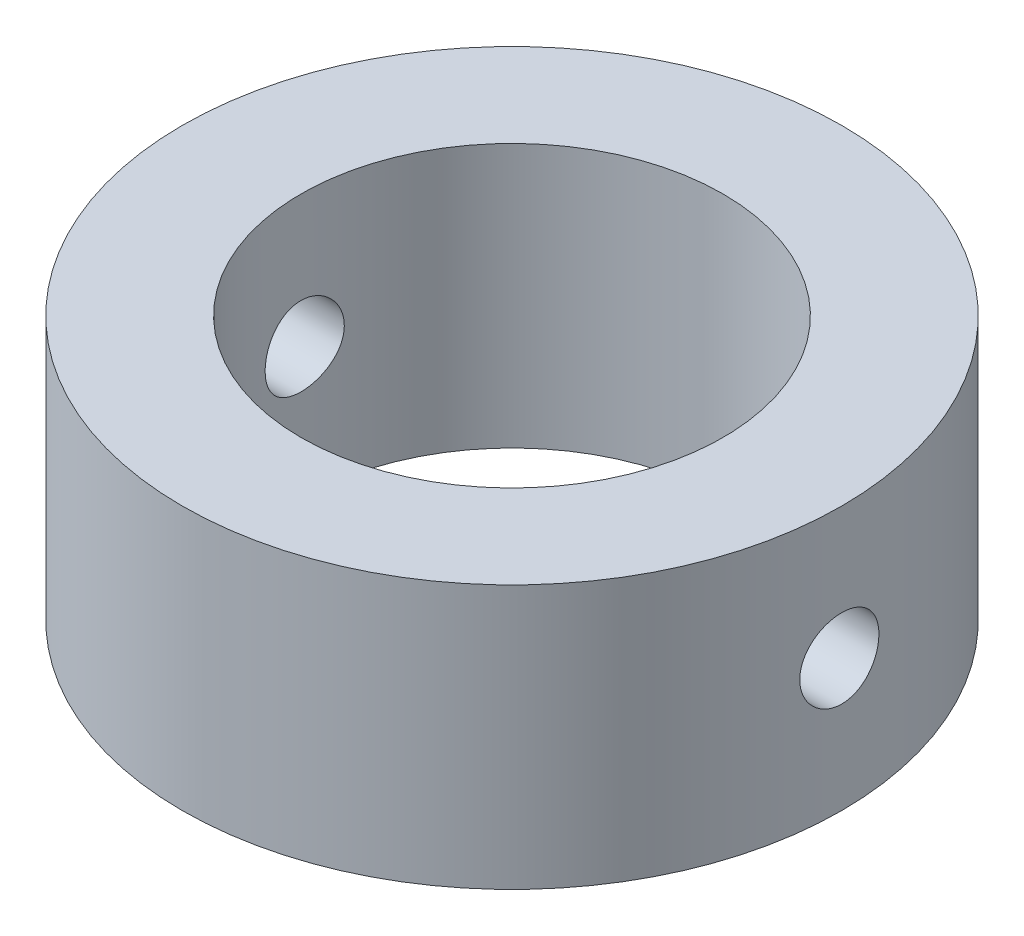
ISO-10303-21;
HEADER;
FILE_DESCRIPTION(('STEP AP214'),'2;1');
FILE_NAME('part.step','',(''),(''),'','','');
FILE_SCHEMA(('AUTOMOTIVE_DESIGN { 1 0 10303 214 1 1 1 1 }'));
ENDSEC;
DATA;
#1=APPLICATION_CONTEXT('core data for automotive mechanical design processes');
#2=APPLICATION_PROTOCOL_DEFINITION('international standard','automotive_design',2000,#1);
#3=PRODUCT_CONTEXT('',#1,'mechanical');
#4=PRODUCT('Part','Part','',(#3));
#5=PRODUCT_RELATED_PRODUCT_CATEGORY('part','',(#4));
#6=PRODUCT_DEFINITION_FORMATION('','',#4);
#7=PRODUCT_DEFINITION_CONTEXT('part definition',#1,'design');
#8=PRODUCT_DEFINITION('design','',#6,#7);
#9=PRODUCT_DEFINITION_SHAPE('','',#8);
#10=(LENGTH_UNIT() NAMED_UNIT(*) SI_UNIT(.MILLI.,.METRE.));
#11=(NAMED_UNIT(*) PLANE_ANGLE_UNIT() SI_UNIT($,.RADIAN.));
#12=(NAMED_UNIT(*) SI_UNIT($,.STERADIAN.) SOLID_ANGLE_UNIT());
#13=UNCERTAINTY_MEASURE_WITH_UNIT(LENGTH_MEASURE(1.E-05),#10,'distance_accuracy_value','');
#14=(GEOMETRIC_REPRESENTATION_CONTEXT(3) GLOBAL_UNCERTAINTY_ASSIGNED_CONTEXT((#13)) GLOBAL_UNIT_ASSIGNED_CONTEXT((#10,
#11,#12)) REPRESENTATION_CONTEXT('',''));
#15=CARTESIAN_POINT('',(0.,0.,0.));
#16=DIRECTION('',(0.,0.,1.));
#17=DIRECTION('',(1.,0.,0.));
#18=AXIS2_PLACEMENT_3D('',#15,#16,#17);
#19=CARTESIAN_POINT('',(0.,10.,0.));
#20=DIRECTION('',(0.,1.,0.));
#21=DIRECTION('',(0.,0.,1.));
#22=AXIS2_PLACEMENT_3D('',#19,#20,#21);
#23=PLANE('',#22);
#24=CARTESIAN_POINT('',(0.,10.,0.));
#25=DIRECTION('',(0.,1.,0.));
#26=DIRECTION('',(0.,0.,1.));
#27=AXIS2_PLACEMENT_3D('',#24,#25,#26);
#28=CIRCLE('',#27,12.5);
#29=CARTESIAN_POINT('',(0.,10.,12.5));
#30=VERTEX_POINT('',#29);
#31=EDGE_CURVE('E10',#30,#30,#28,.T.);
#32=ORIENTED_EDGE('',*,*,#31,.T.);
#33=EDGE_LOOP('',(#32));
#34=FACE_BOUND('',#33,.T.);
#35=CARTESIAN_POINT('',(0.,10.,0.));
#36=DIRECTION('',(0.,1.,0.));
#37=DIRECTION('',(0.,0.,1.));
#38=AXIS2_PLACEMENT_3D('',#35,#36,#37);
#39=CIRCLE('',#38,8.);
#40=CARTESIAN_POINT('',(0.,10.,8.));
#41=VERTEX_POINT('',#40);
#42=EDGE_CURVE('E48',#41,#41,#39,.T.);
#43=ORIENTED_EDGE('',*,*,#42,.F.);
#44=EDGE_LOOP('',(#43));
#45=FACE_BOUND('',#44,.T.);
#46=ADVANCED_FACE('F30',(#34,#45),#23,.T.);
#47=CARTESIAN_POINT('',(0.,0.,0.));
#48=DIRECTION('',(0.,1.,0.));
#49=DIRECTION('',(0.,0.,1.));
#50=AXIS2_PLACEMENT_3D('',#47,#48,#49);
#51=PLANE('',#50);
#52=CARTESIAN_POINT('',(0.,0.,0.));
#53=DIRECTION('',(0.,1.,0.));
#54=DIRECTION('',(0.,0.,1.));
#55=AXIS2_PLACEMENT_3D('',#52,#53,#54);
#56=CIRCLE('',#55,12.5);
#57=CARTESIAN_POINT('',(0.,0.,12.5));
#58=VERTEX_POINT('',#57);
#59=EDGE_CURVE('E43',#58,#58,#56,.T.);
#60=ORIENTED_EDGE('',*,*,#59,.F.);
#61=EDGE_LOOP('',(#60));
#62=FACE_BOUND('',#61,.T.);
#63=CARTESIAN_POINT('',(0.,0.,0.));
#64=DIRECTION('',(0.,1.,0.));
#65=DIRECTION('',(0.,0.,1.));
#66=AXIS2_PLACEMENT_3D('',#63,#64,#65);
#67=CIRCLE('',#66,8.);
#68=CARTESIAN_POINT('',(0.,0.,8.));
#69=VERTEX_POINT('',#68);
#70=EDGE_CURVE('E51',#69,#69,#67,.T.);
#71=ORIENTED_EDGE('',*,*,#70,.T.);
#72=EDGE_LOOP('',(#71));
#73=FACE_BOUND('',#72,.T.);
#74=ADVANCED_FACE('F84',(#62,#73),#51,.F.);
#75=CARTESIAN_POINT('',(0.,10.,0.));
#76=DIRECTION('',(0.,-1.,0.));
#77=DIRECTION('',(0.,0.,-1.));
#78=AXIS2_PLACEMENT_3D('',#75,#76,#77);
#79=CYLINDRICAL_SURFACE('',#78,12.5);
#80=CARTESIAN_POINT('',(12.5,3.5,0.));
#81=CARTESIAN_POINT('',(12.499998867873,3.50000358197072,0.0839320235538497));
#82=CARTESIAN_POINT('',(12.4991457100204,3.50706832934634,0.167917158665596));
#83=CARTESIAN_POINT('',(12.495824352711,3.53514053207769,0.333552285654125));
#84=CARTESIAN_POINT('',(12.4933544466864,3.55616272062529,0.415199714795034));
#85=CARTESIAN_POINT('',(12.4870779632713,3.61152313826301,0.573737397670264));
#86=CARTESIAN_POINT('',(12.4832722657654,3.64585260341209,0.650630743796124));
#87=CARTESIAN_POINT('',(12.4747479632173,3.72683436754165,0.797549578916));
#88=CARTESIAN_POINT('',(12.470029520207,3.77348447987666,0.867576283567579));
#89=CARTESIAN_POINT('',(12.460180052721,3.87803743098762,0.999145657672256));
#90=CARTESIAN_POINT('',(12.4550472515452,3.93599042005596,1.0606483456536));
#91=CARTESIAN_POINT('',(12.4449619698576,4.06139648244395,1.17307965519171));
#92=CARTESIAN_POINT('',(12.4400094983534,4.12885002950932,1.22400774913237));
#93=CARTESIAN_POINT('',(12.4308280185202,4.27160041264919,1.31399171436948));
#94=CARTESIAN_POINT('',(12.4266012951985,4.34692086229007,1.35301037836285));
#95=CARTESIAN_POINT('',(12.4193730672343,4.50310435105437,1.4178302865078));
#96=CARTESIAN_POINT('',(12.4163715196899,4.58396719598465,1.44363199348388));
#97=CARTESIAN_POINT('',(12.4119503036869,4.74852642965571,1.481164650227));
#98=CARTESIAN_POINT('',(12.4105230726271,4.83220726421384,1.49296288993823));
#99=CARTESIAN_POINT('',(12.4093888845306,5.00037246818208,1.50236187609835));
#100=CARTESIAN_POINT('',(12.4096818635516,5.08485680760848,1.49996315026424));
#101=CARTESIAN_POINT('',(12.4119480733153,5.25176298239218,1.48109158039334));
#102=CARTESIAN_POINT('',(12.4139124717338,5.33419331934009,1.46469271611151));
#103=CARTESIAN_POINT('',(12.4192864043804,5.49512351391068,1.41840173085033));
#104=CARTESIAN_POINT('',(12.4226959657844,5.5736232975895,1.38850935612907));
#105=CARTESIAN_POINT('',(12.4305861039738,5.72469473411956,1.31599990349931));
#106=CARTESIAN_POINT('',(12.4350693931099,5.79725073917678,1.27335053101962));
#107=CARTESIAN_POINT('',(12.444599699395,5.93420360545788,1.17656086584735));
#108=CARTESIAN_POINT('',(12.4496467403106,5.99860012245129,1.12242008861578));
#109=CARTESIAN_POINT('',(12.4597751654319,6.11783554218219,1.0037737778109));
#110=CARTESIAN_POINT('',(12.464856563712,6.17261098492853,0.939204450256079));
#111=CARTESIAN_POINT('',(12.4744510399274,6.27055576050016,0.80175397946936));
#112=CARTESIAN_POINT('',(12.478964116721,6.31372507000958,0.728872819540023));
#113=CARTESIAN_POINT('',(12.4869159430851,6.38723164281983,0.576819654131422));
#114=CARTESIAN_POINT('',(12.4903543736405,6.41756509666522,0.497645789357795));
#115=CARTESIAN_POINT('',(12.4957665326545,6.46448936892545,0.33527801113672));
#116=CARTESIAN_POINT('',(12.4977403242792,6.48108078000224,0.252084271220811));
#117=CARTESIAN_POINT('',(12.4999926250152,6.49996812774884,0.0845871981871081));
#118=CARTESIAN_POINT('',(12.5002815046876,6.50235151620035,0.000293860216025356));
#119=CARTESIAN_POINT('',(12.4991593911616,6.49298571106587,-0.167491034121631));
#120=CARTESIAN_POINT('',(12.4977484312654,6.48123679435232,-0.250982606163664));
#121=CARTESIAN_POINT('',(12.4933916690343,6.44401251799845,-0.414537131964179));
#122=CARTESIAN_POINT('',(12.4904505118954,6.41857869347496,-0.494609673184518));
#123=CARTESIAN_POINT('',(12.4833627750896,6.35474964832321,-0.64935269884323));
#124=CARTESIAN_POINT('',(12.4792161574379,6.31635401925496,-0.724023012961737));
#125=CARTESIAN_POINT('',(12.4701542579347,6.22747854204879,-0.866233588832522));
#126=CARTESIAN_POINT('',(12.4652354042322,6.17694193109459,-0.933738144813755));
#127=CARTESIAN_POINT('',(12.455190895971,6.06529957679592,-1.05933812576102));
#128=CARTESIAN_POINT('',(12.4500652338742,6.00419344792603,-1.11743320736475));
#129=CARTESIAN_POINT('',(12.4401529742471,5.87276219228616,-1.22287397613077));
#130=CARTESIAN_POINT('',(12.4353682915654,5.80239049232808,-1.27016181615969));
#131=CARTESIAN_POINT('',(12.4267107496692,5.65465248746222,-1.35224657214666));
#132=CARTESIAN_POINT('',(12.4228378733971,5.57728631344088,-1.38704372178037));
#133=CARTESIAN_POINT('',(12.4164552867251,5.41794469555265,-1.44306498334079));
#134=CARTESIAN_POINT('',(12.4139422637816,5.33598099407031,-1.46432210079673));
#135=CARTESIAN_POINT('',(12.4105542637293,5.16961551525747,-1.49276636081758));
#136=CARTESIAN_POINT('',(12.4096792168553,5.08521384192134,-1.49995410263041));
#137=CARTESIAN_POINT('',(12.4096681633035,4.91694363518141,-1.50004516908965));
#138=CARTESIAN_POINT('',(12.4105210931972,4.83307513711437,-1.49303936835675));
#139=CARTESIAN_POINT('',(12.4138461473713,4.66771660680292,-1.46513424336044));
#140=CARTESIAN_POINT('',(12.4163182722328,4.58622657541221,-1.44423491411034));
#141=CARTESIAN_POINT('',(12.4225998262293,4.42794773055565,-1.38916369910273));
#142=CARTESIAN_POINT('',(12.4264088508406,4.35115750325226,-1.35499582785269));
#143=CARTESIAN_POINT('',(12.4349357269569,4.20438612646495,-1.27436641314005));
#144=CARTESIAN_POINT('',(12.4396535863076,4.13440503577035,-1.22790476354723));
#145=CARTESIAN_POINT('',(12.4495027561294,4.00277352994558,-1.12366844823603));
#146=CARTESIAN_POINT('',(12.4546364290673,3.94117694836686,-1.06582601965075));
#147=CARTESIAN_POINT('',(12.4647177484085,3.828528760217,-0.940610466672237));
#148=CARTESIAN_POINT('',(12.4696653505255,3.7774796511854,-0.873235091318004));
#149=CARTESIAN_POINT('',(12.4788360854662,3.68722471100057,-0.730596612325683));
#150=CARTESIAN_POINT('',(12.4830566108105,3.64806113713886,-0.655306617312087));
#151=CARTESIAN_POINT('',(12.4902709259863,3.58298811777871,-0.499211375842655));
#152=CARTESIAN_POINT('',(12.4932660590307,3.55706415190981,-0.418412282181072));
#153=CARTESIAN_POINT('',(12.4969634163,3.52546828983094,-0.280988550618348));
#154=CARTESIAN_POINT('',(12.4980966397165,3.51593125805681,-0.225233284876743));
#155=CARTESIAN_POINT('',(12.4996153102102,3.50319592825452,-0.112993367846847));
#156=CARTESIAN_POINT('',(12.5000007622246,3.49999758837477,-0.0565087213768126));
#157=CARTESIAN_POINT('',(12.5,3.5,0.));
#158=B_SPLINE_CURVE_WITH_KNOTS('',3,(#80,#81,#82,#83,#84,#85,#86,#87,#88,#89,#90,#91,#92,#93,
#94,#95,#96,#97,#98,#99,#100,#101,#102,#103,#104,#105,#106,#107,#108,#109,#110,#111,#112,#113,
#114,#115,#116,#117,#118,#119,#120,#121,#122,#123,#124,#125,#126,#127,#128,#129,#130,#131,#132,
#133,#134,#135,#136,#137,#138,#139,#140,#141,#142,#143,#144,#145,#146,#147,#148,#149,#150,#151,
#152,#153,#154,#155,#156,#157),.UNSPECIFIED.,.T.,.F.,(4,2,2,2,2,2,2,2,2,2,2,2,2,2,2,2,2,2,2,2,2,
2,2,2,2,2,2,2,2,2,2,2,2,2,2,2,2,2,4),(0.,0.25158967547808,0.503445347043117,0.7551354318778,
1.00678087720846,1.25956936097939,1.51237045452442,1.76595344748199,2.01952755999557,
2.27187819171639,2.5242194433424,2.77523546456127,3.02625620626698,3.27791786855268,
3.52959014434631,3.78286472320159,4.03613981086301,4.28949001347139,4.5428292891131,
4.79460761312113,5.04638100450539,5.29739451278874,5.54841593150834,5.80063460892782,
6.05286248801782,6.30641037908359,6.55995352653149,6.81287624132444,7.06578818330771,
7.31708596596146,7.56838383881169,7.81960573856942,8.07082980715608,8.3235976201016,
8.57642521760045,8.8301414511973,9.08357882396374,9.25296714728134,9.42235435219904),.UNSPECIFIED.);
#159=CARTESIAN_POINT('',(12.5,3.5,0.));
#160=VERTEX_POINT('',#159);
#161=EDGE_CURVE('E74',#160,#160,#158,.T.);
#162=ORIENTED_EDGE('',*,*,#161,.T.);
#163=EDGE_LOOP('',(#162));
#164=FACE_BOUND('',#163,.T.);
#165=CARTESIAN_POINT('',(-12.4096736459909,5.,1.5));
#166=CARTESIAN_POINT('',(-12.4096748089167,4.91607042940482,1.49999641586388));
#167=CARTESIAN_POINT('',(-12.4105342894214,4.8320877399393,1.49293206748169));
#168=CARTESIAN_POINT('',(-12.4138782255216,4.66645769398422,1.46486159354819));
#169=CARTESIAN_POINT('',(-12.4163643992983,4.58481290215949,1.44384072619508));
#170=CARTESIAN_POINT('',(-12.4226761552619,4.42628079724309,1.38848417307918));
#171=CARTESIAN_POINT('',(-12.426500849368,4.34939036943189,1.35415731394874));
#172=CARTESIAN_POINT('',(-12.4350576249844,4.20247642894951,1.27318168778971));
#173=CARTESIAN_POINT('',(-12.4397895458966,4.13245170421602,1.22653510106007));
#174=CARTESIAN_POINT('',(-12.4496550027324,4.00088011419491,1.12198571965019));
#175=CARTESIAN_POINT('',(-12.4547902908254,3.9393738528257,1.06403198625323));
#176=CARTESIAN_POINT('',(-12.4648680792729,3.82693564091905,0.938622932174394));
#177=CARTESIAN_POINT('',(-12.4698105701984,3.7760042070291,0.871167147527068));
#178=CARTESIAN_POINT('',(-12.4789637011531,3.68601673353186,0.728414784233988));
#179=CARTESIAN_POINT('',(-12.4831720690333,3.64699729213018,0.653094976924494));
#180=CARTESIAN_POINT('',(-12.4903635621621,3.58217576980763,0.496912883636388));
#181=CARTESIAN_POINT('',(-12.4933467294733,3.55637323512614,0.41605078804277));
#182=CARTESIAN_POINT('',(-12.4977393662263,3.51883887194827,0.251493928492541));
#183=CARTESIAN_POINT('',(-12.4991563682204,3.50703967327711,0.167814735521689));
#184=CARTESIAN_POINT('',(-12.5002827183051,3.49763820034474,-0.000347248334282786));
#185=CARTESIAN_POINT('',(-12.4999921286017,3.50003540892089,-0.08483000983417));
#186=CARTESIAN_POINT('',(-12.4977421462633,3.51890456092568,-0.251742833758765));
#187=CARTESIAN_POINT('',(-12.4957913442169,3.5353040524862,-0.334181218784107));
#188=CARTESIAN_POINT('',(-12.490449821119,3.581599075858,-0.495127185045589));
#189=CARTESIAN_POINT('',(-12.4870590745233,3.61149484709082,-0.573634696521302));
#190=CARTESIAN_POINT('',(-12.4792038952277,3.68401136445326,-0.724715561629688));
#191=CARTESIAN_POINT('',(-12.4747368094346,3.72666361800321,-0.797273648637692));
#192=CARTESIAN_POINT('',(-12.465229048358,3.82345944947808,-0.934229460099392));
#193=CARTESIAN_POINT('',(-12.4601883488298,3.8776035132078,-0.998626839383445));
#194=CARTESIAN_POINT('',(-12.4500603372648,3.99625217477023,-1.11785860561525));
#195=CARTESIAN_POINT('',(-12.4449729316271,4.06081989068675,-1.17263019439189));
#196=CARTESIAN_POINT('',(-12.4353563023037,4.19826575683975,-1.27056795912578));
#197=CARTESIAN_POINT('',(-12.4308270801297,4.27114392958224,-1.31373410365263));
#198=CARTESIAN_POINT('',(-12.4228396027608,4.42319624507369,-1.38723839179325));
#199=CARTESIAN_POINT('',(-12.4193817467283,4.50237272062895,-1.41757175578821));
#200=CARTESIAN_POINT('',(-12.4139364153306,4.66474617975059,-1.46449505016189));
#201=CARTESIAN_POINT('',(-12.4119488748366,4.74794298505965,-1.48108558929276));
#202=CARTESIAN_POINT('',(-12.4096810007818,4.91544154818834,-1.49996964356083));
#203=CARTESIAN_POINT('',(-12.4093901280317,4.99973321794057,-1.50235142135386));
#204=CARTESIAN_POINT('',(-12.4105206650573,5.16751439042147,-1.49298299027801));
#205=CARTESIAN_POINT('',(-12.411942041265,5.25100390884369,-1.48123305845624));
#206=CARTESIAN_POINT('',(-12.4163273137489,5.41454789179899,-1.44400895971009));
#207=CARTESIAN_POINT('',(-12.4192864301079,5.49461217340466,-1.41857731249469));
#208=CARTESIAN_POINT('',(-12.4264098926624,5.64933964148798,-1.35475538396312));
#209=CARTESIAN_POINT('',(-12.4305742780457,5.72400265225152,-1.31636468129306));
#210=CARTESIAN_POINT('',(-12.4396643656649,5.86620814748731,-1.22749651360805));
#211=CARTESIAN_POINT('',(-12.4445936804928,5.93371414344065,-1.17696103570738));
#212=CARTESIAN_POINT('',(-12.4546467770184,6.0593175565059,-1.06532008918354));
#213=CARTESIAN_POINT('',(-12.4597705656719,6.11741463670294,-1.0042142422181));
#214=CARTESIAN_POINT('',(-12.4696675472455,6.22285987361746,-0.872782136333861));
#215=CARTESIAN_POINT('',(-12.4744387628015,6.27015012325571,-0.802409249708916));
#216=CARTESIAN_POINT('',(-12.483063621558,6.35223910466455,-0.654668214705289));
#217=CARTESIAN_POINT('',(-12.4869172820019,6.38703807118722,-0.577300197822208));
#218=CARTESIAN_POINT('',(-12.4932640215257,6.4430605024379,-0.417959622359992));
#219=CARTESIAN_POINT('',(-12.4957604851314,6.46431775994213,-0.33599908532359));
#220=CARTESIAN_POINT('',(-12.4991255682254,6.49276337179108,-0.169640292495738));
#221=CARTESIAN_POINT('',(-12.4999942550783,6.49995230834657,-0.0852421377306299));
#222=CARTESIAN_POINT('',(-12.5000056524324,6.50004692205616,0.0830300031278301));
#223=CARTESIAN_POINT('',(-12.4991591682624,6.49304201834161,0.166903952329436));
#224=CARTESIAN_POINT('',(-12.4958567701035,6.46513677254876,0.332273612398118));
#225=CARTESIAN_POINT('',(-12.4934008566421,6.44423643502524,0.413769324044744));
#226=CARTESIAN_POINT('',(-12.4871544009745,6.38916099243421,0.572059777991808));
#227=CARTESIAN_POINT('',(-12.4833642539575,6.35498981777275,0.648855904374));
#228=CARTESIAN_POINT('',(-12.474869622158,6.2743519652078,0.795637705262656));
#229=CARTESIAN_POINT('',(-12.4701651299761,6.22788518779857,0.865623324646852));
#230=CARTESIAN_POINT('',(-12.4603319681132,6.12364315899687,0.997254742124292));
#231=CARTESIAN_POINT('',(-12.4552009088046,6.06580132233712,1.0588476339384));
#232=CARTESIAN_POINT('',(-12.4451123432295,5.94058848142378,1.17148865356204));
#233=CARTESIAN_POINT('',(-12.4401548784622,5.87321521774934,1.22253427406543));
#234=CARTESIAN_POINT('',(-12.4309559603764,5.73057853191475,1.31278537364373));
#235=CARTESIAN_POINT('',(-12.4267171228205,5.65528783586352,1.35194799100155));
#236=CARTESIAN_POINT('',(-12.419466118837,5.49919112312461,1.41701902911872));
#237=CARTESIAN_POINT('',(-12.4164526081981,5.41839126440112,1.44294198213015));
#238=CARTESIAN_POINT('',(-12.4127313618494,5.2809702304473,1.4745350503682));
#239=CARTESIAN_POINT('',(-12.4115903654975,5.22521862402006,1.48407082470974));
#240=CARTESIAN_POINT('',(-12.4100611186528,5.11298603393288,1.49680448454756));
#241=CARTESIAN_POINT('',(-12.4096728630583,5.0565050552187,1.50000241299709));
#242=CARTESIAN_POINT('',(-12.4096736459909,5.,1.5));
#243=B_SPLINE_CURVE_WITH_KNOTS('',3,(#165,#166,#167,#168,#169,#170,#171,#172,#173,#174,#175,
#176,#177,#178,#179,#180,#181,#182,#183,#184,#185,#186,#187,#188,#189,#190,#191,#192,#193,#194,
#195,#196,#197,#198,#199,#200,#201,#202,#203,#204,#205,#206,#207,#208,#209,#210,#211,#212,#213,
#214,#215,#216,#217,#218,#219,#220,#221,#222,#223,#224,#225,#226,#227,#228,#229,#230,#231,#232,
#233,#234,#235,#236,#237,#238,#239,#240,#241,#242),.UNSPECIFIED.,.T.,.F.,(4,2,2,2,2,2,2,2,2,2,2,
2,2,2,2,2,2,2,2,2,2,2,2,2,2,2,2,2,2,2,2,2,2,2,2,2,2,2,4),(0.,0.25158230660961,0.503430774819312,
0.755112462522263,1.0067496383611,1.25954776660377,1.51235824273611,1.7659378087677,
2.01950866836447,2.27185458608052,2.52419131111312,2.77523023079344,3.02627360403336,
3.27794222677636,3.52962149067919,3.78288622204422,4.03615163930559,4.28951130338294,
4.54285974404081,4.79463277043148,5.0464008609825,5.29739099483104,5.54838929022027,
5.80061125155309,6.05284224246468,6.30639464647639,6.55994228515919,6.81285470170488,
7.06575665136928,7.31707030939076,7.56838388503438,7.81962308616498,8.07086432058376,
8.32362252061906,8.57644073759112,8.83016031080823,9.08360079205963,9.25297814464872,
9.42235434931909),.UNSPECIFIED.);
#244=CARTESIAN_POINT('',(-12.4096736459909,5.,1.5));
#245=VERTEX_POINT('',#244);
#246=EDGE_CURVE('E70',#245,#245,#243,.T.);
#247=ORIENTED_EDGE('',*,*,#246,.T.);
#248=EDGE_LOOP('',(#247));
#249=FACE_BOUND('',#248,.T.);
#250=ORIENTED_EDGE('',*,*,#31,.F.);
#251=EDGE_LOOP('',(#250));
#252=FACE_BOUND('',#251,.T.);
#253=ORIENTED_EDGE('',*,*,#59,.T.);
#254=EDGE_LOOP('',(#253));
#255=FACE_BOUND('',#254,.T.);
#256=ADVANCED_FACE('F32',(#164,#249,#252,#255),#79,.T.);
#257=CARTESIAN_POINT('',(0.,10.,0.));
#258=DIRECTION('',(0.,-1.,0.));
#259=DIRECTION('',(0.,0.,-1.));
#260=AXIS2_PLACEMENT_3D('',#257,#258,#259);
#261=CYLINDRICAL_SURFACE('',#260,8.);
#262=CARTESIAN_POINT('',(7.85811682275086,5.,1.5));
#263=CARTESIAN_POINT('',(7.85811843793494,5.08345720801174,1.49999679883246));
#264=CARTESIAN_POINT('',(7.85946079760266,5.16695594821839,1.49301126348936));
#265=CARTESIAN_POINT('',(7.86467851014364,5.33159896158191,1.46527253251805));
#266=CARTESIAN_POINT('',(7.86855601173205,5.41274117642748,1.44450765768477));
#267=CARTESIAN_POINT('',(7.87838976464885,5.57026507137088,1.38987035617788));
#268=CARTESIAN_POINT('',(7.88434407905997,5.64665110930729,1.35601013954374));
#269=CARTESIAN_POINT('',(7.89765826320959,5.79265355928681,1.27617565760366));
#270=CARTESIAN_POINT('',(7.90501802325622,5.8622704990033,1.23020233759193));
#271=CARTESIAN_POINT('',(7.92041614838944,5.99363019919913,1.12683678942622));
#272=CARTESIAN_POINT('',(7.92846116625679,6.05527648347173,1.06932292933092));
#273=CARTESIAN_POINT('',(7.94426457664034,6.16810438959956,0.94477177880355));
#274=CARTESIAN_POINT('',(7.95202295031153,6.21928532442479,0.877733863624943));
#275=CARTESIAN_POINT('',(7.96645017828405,6.31009937660052,0.735403894570161));
#276=CARTESIAN_POINT('',(7.97311028052363,6.34964153351942,0.660052840033864));
#277=CARTESIAN_POINT('',(7.98451608632931,6.41546954227353,0.503631283250761));
#278=CARTESIAN_POINT('',(7.98926194728334,6.44175648399022,0.422561251859505));
#279=CARTESIAN_POINT('',(7.99625755123778,6.48002954861113,0.258002746187415));
#280=CARTESIAN_POINT('',(7.99853565976327,6.49217830592269,0.174553323244856));
#281=CARTESIAN_POINT('',(8.00043684615594,6.5023368877004,0.00677167603538234));
#282=CARTESIAN_POINT('',(8.00006015010697,6.50034791613906,-0.077560472447671));
#283=CARTESIAN_POINT('',(7.99671633763241,6.48241222885285,-0.243598357899397));
#284=CARTESIAN_POINT('',(7.99378172247214,6.46664063056999,-0.32532376045147));
#285=CARTESIAN_POINT('',(7.98568826333561,6.42186435060476,-0.484947165715476));
#286=CARTESIAN_POINT('',(7.98052933829966,6.3928591866542,-0.562845028826541));
#287=CARTESIAN_POINT('',(7.96851260297339,6.3222722689417,-0.713110065751522));
#288=CARTESIAN_POINT('',(7.96164537590825,6.2806205120875,-0.785443571838533));
#289=CARTESIAN_POINT('',(7.9469714754285,6.18597433092285,-0.922159977214638));
#290=CARTESIAN_POINT('',(7.93916470651164,6.13297875311242,-0.986542066910785));
#291=CARTESIAN_POINT('',(7.92333513680567,6.01618429701647,-1.10656561896904));
#292=CARTESIAN_POINT('',(7.91531085901621,5.95223221609792,-1.16205790757041));
#293=CARTESIAN_POINT('',(7.9000650892462,5.81585046872137,-1.26155171851261));
#294=CARTESIAN_POINT('',(7.89284360901351,5.74342067823536,-1.30555307271182));
#295=CARTESIAN_POINT('',(7.88001893307121,5.59194172929734,-1.38085852224478));
#296=CARTESIAN_POINT('',(7.87441850530261,5.51288154280936,-1.41214093645421));
#297=CARTESIAN_POINT('',(7.86551242396689,5.3504988158768,-1.46093656975056));
#298=CARTESIAN_POINT('',(7.8622065103862,5.26717675953522,-1.47845134901108));
#299=CARTESIAN_POINT('',(7.85831520301005,5.09998067114412,-1.49899672649739));
#300=CARTESIAN_POINT('',(7.85768955816136,5.01613388443449,-1.50224164285859));
#301=CARTESIAN_POINT('',(7.8591219142084,4.84909654491285,-1.49472968881724));
#302=CARTESIAN_POINT('',(7.86117978238611,4.76590595985192,-1.48397351086433));
#303=CARTESIAN_POINT('',(7.86770980063205,4.60324709694561,-1.44894868195883));
#304=CARTESIAN_POINT('',(7.87216186690878,4.5237537473751,-1.4247923858399));
#305=CARTESIAN_POINT('',(7.88296134156618,4.36994281026984,-1.3637722437906));
#306=CARTESIAN_POINT('',(7.88930888963281,4.29562560468467,-1.32690746128795));
#307=CARTESIAN_POINT('',(7.90327577863685,4.15333238095683,-1.2410235311966));
#308=CARTESIAN_POINT('',(7.91090895425315,4.08543946213393,-1.19186899639621));
#309=CARTESIAN_POINT('',(7.926548113681,3.95878795978567,-1.08298344344247));
#310=CARTESIAN_POINT('',(7.93455413096494,3.90003019844423,-1.02325147433084));
#311=CARTESIAN_POINT('',(7.95016624005946,3.79251623646587,-0.893949417870385));
#312=CARTESIAN_POINT('',(7.95776555833305,3.74390417339403,-0.82425853409589));
#313=CARTESIAN_POINT('',(7.97159404810351,3.65907879382234,-0.67757452304014));
#314=CARTESIAN_POINT('',(7.97782327234725,3.62286499997499,-0.600581677038528));
#315=CARTESIAN_POINT('',(7.98818057995848,3.56407990213592,-0.441877541578684));
#316=CARTESIAN_POINT('',(7.99231954730142,3.54143781243859,-0.360193213078988));
#317=CARTESIAN_POINT('',(7.99807642083745,3.51021295171011,-0.194096227381571));
#318=CARTESIAN_POINT('',(7.99969459229933,3.50162870133729,-0.109683858215851));
#319=CARTESIAN_POINT('',(8.00022227515441,3.49881469848156,0.0580907602505094));
#320=CARTESIAN_POINT('',(7.99917286625032,3.50436724687047,0.141449307066268));
#321=CARTESIAN_POINT('',(7.99456866611703,3.52919242776844,0.3060233692792));
#322=CARTESIAN_POINT('',(7.99101389890671,3.54846492874421,0.38723890521369));
#323=CARTESIAN_POINT('',(7.98179837978045,3.60009120738372,0.545106475595485));
#324=CARTESIAN_POINT('',(7.97614135981576,3.63242181288101,0.621766319318224));
#325=CARTESIAN_POINT('',(7.96333372068771,3.70922045365518,0.768605631316694));
#326=CARTESIAN_POINT('',(7.95618300146483,3.75368930210665,0.838784665003271));
#327=CARTESIAN_POINT('',(7.94104779859941,3.85425145444232,0.971755027780007));
#328=CARTESIAN_POINT('',(7.93305284591272,3.91050203386171,1.03442623539053));
#329=CARTESIAN_POINT('',(7.91719633538833,4.03270456249271,1.14951536065485));
#330=CARTESIAN_POINT('',(7.90933480936765,4.09865879037372,1.2019308632478));
#331=CARTESIAN_POINT('',(7.89455577425926,4.23912645470335,1.29547633945385));
#332=CARTESIAN_POINT('',(7.88764767280729,4.31371343966764,1.33649740531872));
#333=CARTESIAN_POINT('',(7.87567084650033,4.46882578997974,1.40536132423417));
#334=CARTESIAN_POINT('',(7.87060038649116,4.54934546658938,1.43321661638912));
#335=CARTESIAN_POINT('',(7.86393016292125,4.69175228806591,1.46929726596175));
#336=CARTESIAN_POINT('',(7.86176310717932,4.75280572376195,1.4807910573985));
#337=CARTESIAN_POINT('',(7.85885585595504,4.87589846842032,1.49614351076215));
#338=CARTESIAN_POINT('',(7.85811562163282,4.93793775050033,1.50000238052127));
#339=CARTESIAN_POINT('',(7.85811682275086,5.,1.5));
#340=B_SPLINE_CURVE_WITH_KNOTS('',3,(#262,#263,#264,#265,#266,#267,#268,#269,#270,#271,#272,
#273,#274,#275,#276,#277,#278,#279,#280,#281,#282,#283,#284,#285,#286,#287,#288,#289,#290,#291,
#292,#293,#294,#295,#296,#297,#298,#299,#300,#301,#302,#303,#304,#305,#306,#307,#308,#309,#310,
#311,#312,#313,#314,#315,#316,#317,#318,#319,#320,#321,#322,#323,#324,#325,#326,#327,#328,#329,
#330,#331,#332,#333,#334,#335,#336,#337,#338,#339),.UNSPECIFIED.,.T.,.F.,(4,2,2,2,2,2,2,2,2,2,2,
2,2,2,2,2,2,2,2,2,2,2,2,2,2,2,2,2,2,2,2,2,2,2,2,2,2,2,4),(0.,0.250144505793186,
0.500501302380393,0.750625227978433,1.00072963993908,1.25362335698691,1.50653367069315,
1.76137104348047,2.0161874593964,2.26804275460261,2.51987660200648,2.76855650598725,
3.01724547328425,3.26733691984219,3.51745380911785,3.77140614764064,4.025362201924,
4.27974936118266,4.53410768866488,4.78463248587075,5.03514489338718,5.28358792315369,
5.53204926624317,5.78337862654144,6.03473059394677,6.28944125495871,6.54414210821705,
6.79750269418683,7.05083661667331,7.30029300570138,7.54974700322168,7.79876026530358,
8.0477902135711,8.30038464008745,8.55303847730765,8.80803001818118,9.06278015749119,
9.24880307527215,9.43482092920425),.UNSPECIFIED.);
#341=CARTESIAN_POINT('',(7.85811682275086,5.,1.5));
#342=VERTEX_POINT('',#341);
#343=EDGE_CURVE('E35',#342,#342,#340,.T.);
#344=ORIENTED_EDGE('',*,*,#343,.F.);
#345=EDGE_LOOP('',(#344));
#346=FACE_BOUND('',#345,.T.);
#347=CARTESIAN_POINT('',(-7.85811682275086,5.,1.5));
#348=CARTESIAN_POINT('',(-7.85811843793494,4.91654279198826,1.49999679883246));
#349=CARTESIAN_POINT('',(-7.85946079760266,4.83304405178161,1.49301126348936));
#350=CARTESIAN_POINT('',(-7.86467851014364,4.66840103841809,1.46527253251805));
#351=CARTESIAN_POINT('',(-7.86855601173205,4.58725882357252,1.44450765768477));
#352=CARTESIAN_POINT('',(-7.87838976464885,4.42973492862912,1.38987035617788));
#353=CARTESIAN_POINT('',(-7.88434407905997,4.35334889069271,1.35601013954374));
#354=CARTESIAN_POINT('',(-7.89765826320959,4.20734644071319,1.27617565760366));
#355=CARTESIAN_POINT('',(-7.90501802325622,4.1377295009967,1.23020233759193));
#356=CARTESIAN_POINT('',(-7.92041614838944,4.00636980080087,1.12683678942622));
#357=CARTESIAN_POINT('',(-7.92846116625679,3.94472351652827,1.06932292933092));
#358=CARTESIAN_POINT('',(-7.94426457664034,3.83189561040044,0.94477177880355));
#359=CARTESIAN_POINT('',(-7.95202295031153,3.78071467557521,0.877733863624944));
#360=CARTESIAN_POINT('',(-7.96645017828405,3.68990062339948,0.735403894570162));
#361=CARTESIAN_POINT('',(-7.97311028052363,3.65035846648058,0.660052840033865));
#362=CARTESIAN_POINT('',(-7.98451608632931,3.58453045772647,0.503631283250761));
#363=CARTESIAN_POINT('',(-7.98926194728334,3.55824351600978,0.422561251859505));
#364=CARTESIAN_POINT('',(-7.99625755123778,3.51997045138887,0.258002746187415));
#365=CARTESIAN_POINT('',(-7.99853565976327,3.50782169407731,0.174553323244856));
#366=CARTESIAN_POINT('',(-8.00043684615594,3.4976631122996,0.00677167603538203));
#367=CARTESIAN_POINT('',(-8.00006015010697,3.49965208386094,-0.0775604724476713));
#368=CARTESIAN_POINT('',(-7.99671633763241,3.51758777114715,-0.243598357899398));
#369=CARTESIAN_POINT('',(-7.99378172247214,3.53335936943001,-0.32532376045147));
#370=CARTESIAN_POINT('',(-7.98568826333561,3.57813564939524,-0.484947165715477));
#371=CARTESIAN_POINT('',(-7.98052933829966,3.6071408133458,-0.562845028826542));
#372=CARTESIAN_POINT('',(-7.96851260297339,3.6777277310583,-0.713110065751522));
#373=CARTESIAN_POINT('',(-7.96164537590825,3.7193794879125,-0.785443571838534));
#374=CARTESIAN_POINT('',(-7.9469714754285,3.81402566907715,-0.922159977214639));
#375=CARTESIAN_POINT('',(-7.93916470651164,3.86702124688758,-0.986542066910786));
#376=CARTESIAN_POINT('',(-7.92333513680567,3.98381570298353,-1.10656561896904));
#377=CARTESIAN_POINT('',(-7.91531085901621,4.04776778390208,-1.16205790757041));
#378=CARTESIAN_POINT('',(-7.9000650892462,4.18414953127863,-1.26155171851261));
#379=CARTESIAN_POINT('',(-7.89284360901351,4.25657932176464,-1.30555307271182));
#380=CARTESIAN_POINT('',(-7.88001893307121,4.40805827070266,-1.38085852224478));
#381=CARTESIAN_POINT('',(-7.87441850530261,4.48711845719065,-1.41214093645421));
#382=CARTESIAN_POINT('',(-7.86551242396689,4.6495011841232,-1.46093656975056));
#383=CARTESIAN_POINT('',(-7.8622065103862,4.73282324046479,-1.47845134901108));
#384=CARTESIAN_POINT('',(-7.85831520301005,4.90001932885588,-1.49899672649739));
#385=CARTESIAN_POINT('',(-7.85768955816136,4.98386611556552,-1.50224164285859));
#386=CARTESIAN_POINT('',(-7.8591219142084,5.15090345508715,-1.49472968881724));
#387=CARTESIAN_POINT('',(-7.86117978238611,5.23409404014809,-1.48397351086433));
#388=CARTESIAN_POINT('',(-7.86770980063205,5.39675290305439,-1.44894868195883));
#389=CARTESIAN_POINT('',(-7.87216186690878,5.4762462526249,-1.4247923858399));
#390=CARTESIAN_POINT('',(-7.88296134156619,5.63005718973016,-1.3637722437906));
#391=CARTESIAN_POINT('',(-7.88930888963281,5.70437439531533,-1.32690746128795));
#392=CARTESIAN_POINT('',(-7.90327577863685,5.84666761904317,-1.2410235311966));
#393=CARTESIAN_POINT('',(-7.91090895425315,5.91456053786607,-1.19186899639621));
#394=CARTESIAN_POINT('',(-7.926548113681,6.04121204021433,-1.08298344344247));
#395=CARTESIAN_POINT('',(-7.93455413096494,6.09996980155578,-1.02325147433083));
#396=CARTESIAN_POINT('',(-7.95016624005946,6.20748376353413,-0.893949417870384));
#397=CARTESIAN_POINT('',(-7.95776555833305,6.25609582660597,-0.824258534095889));
#398=CARTESIAN_POINT('',(-7.97159404810351,6.34092120617767,-0.677574523040139));
#399=CARTESIAN_POINT('',(-7.97782327234725,6.37713500002501,-0.600581677038527));
#400=CARTESIAN_POINT('',(-7.98818057995848,6.43592009786408,-0.441877541578683));
#401=CARTESIAN_POINT('',(-7.99231954730142,6.45856218756141,-0.360193213078986));
#402=CARTESIAN_POINT('',(-7.99807642083745,6.48978704828989,-0.194096227381569));
#403=CARTESIAN_POINT('',(-7.99969459229933,6.49837129866271,-0.10968385821585));
#404=CARTESIAN_POINT('',(-8.00022227515441,6.50118530151844,0.0580907602505101));
#405=CARTESIAN_POINT('',(-7.99917286625032,6.49563275312953,0.141449307066269));
#406=CARTESIAN_POINT('',(-7.99456866611703,6.47080757223156,0.3060233692792));
#407=CARTESIAN_POINT('',(-7.99101389890671,6.45153507125579,0.387238905213691));
#408=CARTESIAN_POINT('',(-7.98179837978045,6.39990879261628,0.545106475595485));
#409=CARTESIAN_POINT('',(-7.97614135981576,6.36757818711899,0.621766319318224));
#410=CARTESIAN_POINT('',(-7.96333372068771,6.29077954634482,0.768605631316695));
#411=CARTESIAN_POINT('',(-7.95618300146483,6.24631069789335,0.838784665003272));
#412=CARTESIAN_POINT('',(-7.94104779859941,6.14574854555768,0.971755027780008));
#413=CARTESIAN_POINT('',(-7.93305284591272,6.08949796613829,1.03442623539053));
#414=CARTESIAN_POINT('',(-7.91719633538833,5.96729543750729,1.14951536065485));
#415=CARTESIAN_POINT('',(-7.90933480936765,5.90134120962628,1.2019308632478));
#416=CARTESIAN_POINT('',(-7.89455577425926,5.76087354529665,1.29547633945385));
#417=CARTESIAN_POINT('',(-7.88764767280729,5.68628656033236,1.33649740531872));
#418=CARTESIAN_POINT('',(-7.87567084650033,5.53117421002026,1.40536132423417));
#419=CARTESIAN_POINT('',(-7.87060038649116,5.45065453341062,1.43321661638912));
#420=CARTESIAN_POINT('',(-7.86393016292125,5.30824771193408,1.46929726596175));
#421=CARTESIAN_POINT('',(-7.86176310717932,5.24719427623805,1.48079105739851));
#422=CARTESIAN_POINT('',(-7.85885585595504,5.12410153157968,1.49614351076215));
#423=CARTESIAN_POINT('',(-7.85811562163282,5.06206224949967,1.50000238052127));
#424=CARTESIAN_POINT('',(-7.85811682275086,5.,1.5));
#425=B_SPLINE_CURVE_WITH_KNOTS('',3,(#347,#348,#349,#350,#351,#352,#353,#354,#355,#356,#357,
#358,#359,#360,#361,#362,#363,#364,#365,#366,#367,#368,#369,#370,#371,#372,#373,#374,#375,#376,
#377,#378,#379,#380,#381,#382,#383,#384,#385,#386,#387,#388,#389,#390,#391,#392,#393,#394,#395,
#396,#397,#398,#399,#400,#401,#402,#403,#404,#405,#406,#407,#408,#409,#410,#411,#412,#413,#414,
#415,#416,#417,#418,#419,#420,#421,#422,#423,#424),.UNSPECIFIED.,.T.,.F.,(4,2,2,2,2,2,2,2,2,2,2,
2,2,2,2,2,2,2,2,2,2,2,2,2,2,2,2,2,2,2,2,2,2,2,2,2,2,2,4),(0.,0.250144505793186,
0.500501302380393,0.750625227978433,1.00072963993908,1.25362335698691,1.50653367069315,
1.76137104348047,2.0161874593964,2.26804275460261,2.51987660200648,2.76855650598725,
3.01724547328425,3.26733691984219,3.51745380911785,3.77140614764064,4.025362201924,
4.27974936118267,4.53410768866488,4.78463248587075,5.03514489338718,5.28358792315369,
5.53204926624317,5.78337862654144,6.03473059394677,6.28944125495871,6.54414210821705,
6.79750269418683,7.0508366166733,7.30029300570138,7.54974700322167,7.79876026530358,
8.0477902135711,8.30038464008745,8.55303847730765,8.80803001818118,9.06278015749119,
9.24880307527215,9.43482092920425),.UNSPECIFIED.);
#426=CARTESIAN_POINT('',(-7.85811682275086,5.,1.5));
#427=VERTEX_POINT('',#426);
#428=EDGE_CURVE('E53',#427,#427,#425,.T.);
#429=ORIENTED_EDGE('',*,*,#428,.F.);
#430=EDGE_LOOP('',(#429));
#431=FACE_BOUND('',#430,.T.);
#432=ORIENTED_EDGE('',*,*,#42,.T.);
#433=EDGE_LOOP('',(#432));
#434=FACE_BOUND('',#433,.T.);
#435=ORIENTED_EDGE('',*,*,#70,.F.);
#436=EDGE_LOOP('',(#435));
#437=FACE_BOUND('',#436,.T.);
#438=ADVANCED_FACE('F57',(#346,#431,#434,#437),#261,.F.);
#439=CARTESIAN_POINT('',(12.5,5.,0.));
#440=DIRECTION('',(-1.,0.,0.));
#441=DIRECTION('',(0.,0.,1.));
#442=AXIS2_PLACEMENT_3D('',#439,#440,#441);
#443=CYLINDRICAL_SURFACE('',#442,1.5);
#444=ORIENTED_EDGE('',*,*,#428,.T.);
#445=EDGE_LOOP('',(#444));
#446=FACE_BOUND('',#445,.T.);
#447=ORIENTED_EDGE('',*,*,#246,.F.);
#448=EDGE_LOOP('',(#447));
#449=FACE_BOUND('',#448,.T.);
#450=ADVANCED_FACE('F63',(#446,#449),#443,.F.);
#451=ORIENTED_EDGE('',*,*,#343,.T.);
#452=EDGE_LOOP('',(#451));
#453=FACE_BOUND('',#452,.T.);
#454=ORIENTED_EDGE('',*,*,#161,.F.);
#455=EDGE_LOOP('',(#454));
#456=FACE_BOUND('',#455,.T.);
#457=ADVANCED_FACE('F60',(#453,#456),#443,.F.);
#458=CLOSED_SHELL('',(#46,#74,#256,#438,#450,#457));
#459=MANIFOLD_SOLID_BREP('B2',#458);
#460=ADVANCED_BREP_SHAPE_REPRESENTATION('',(#18,#459),#14);
#461=SHAPE_DEFINITION_REPRESENTATION(#9,#460);
ENDSEC;
END-ISO-10303-21;
